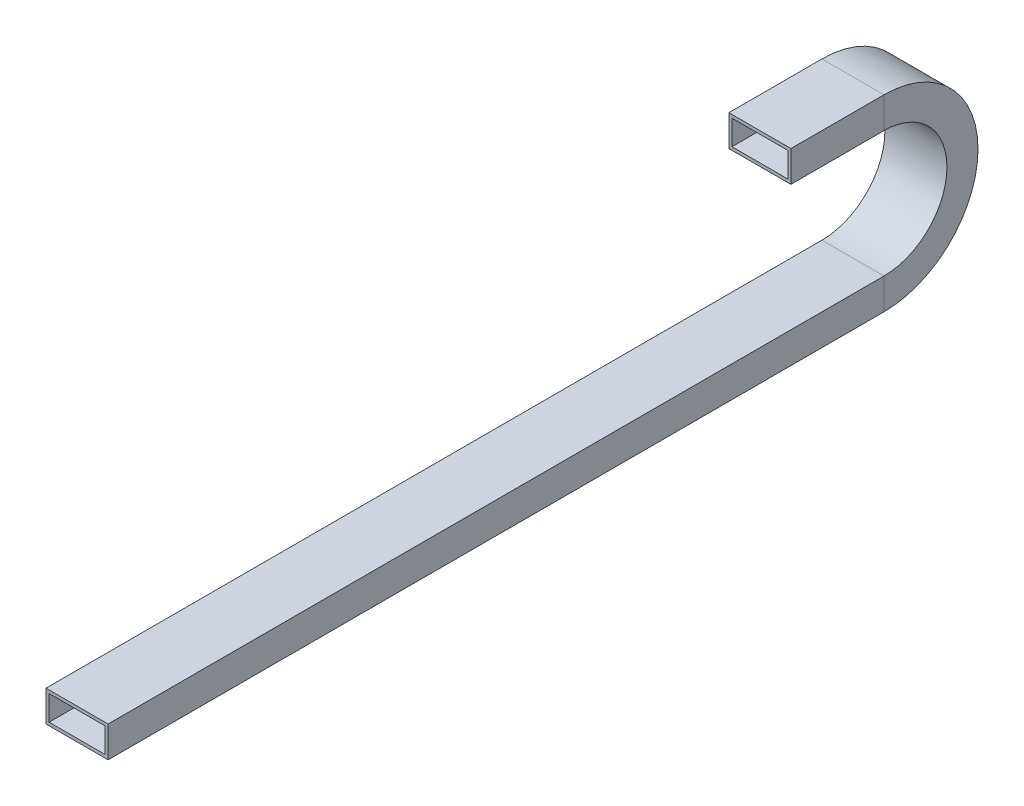
ISO-10303-21;
HEADER;
FILE_DESCRIPTION(('STEP AP214'),'2;1');
FILE_NAME('part.step','',(''),(''),'','','');
FILE_SCHEMA(('AUTOMOTIVE_DESIGN { 1 0 10303 214 1 1 1 1 }'));
ENDSEC;
DATA;
#1=APPLICATION_CONTEXT('core data for automotive mechanical design processes');
#2=APPLICATION_PROTOCOL_DEFINITION('international standard','automotive_design',2000,#1);
#3=PRODUCT_CONTEXT('',#1,'mechanical');
#4=PRODUCT('Part','Part','',(#3));
#5=PRODUCT_RELATED_PRODUCT_CATEGORY('part','',(#4));
#6=PRODUCT_DEFINITION_FORMATION('','',#4);
#7=PRODUCT_DEFINITION_CONTEXT('part definition',#1,'design');
#8=PRODUCT_DEFINITION('design','',#6,#7);
#9=PRODUCT_DEFINITION_SHAPE('','',#8);
#10=(LENGTH_UNIT() NAMED_UNIT(*) SI_UNIT(.MILLI.,.METRE.));
#11=(NAMED_UNIT(*) PLANE_ANGLE_UNIT() SI_UNIT($,.RADIAN.));
#12=(NAMED_UNIT(*) SI_UNIT($,.STERADIAN.) SOLID_ANGLE_UNIT());
#13=UNCERTAINTY_MEASURE_WITH_UNIT(LENGTH_MEASURE(1.E-05),#10,'distance_accuracy_value','');
#14=(GEOMETRIC_REPRESENTATION_CONTEXT(3) GLOBAL_UNCERTAINTY_ASSIGNED_CONTEXT((#13)) GLOBAL_UNIT_ASSIGNED_CONTEXT((#10,
#11,#12)) REPRESENTATION_CONTEXT('',''));
#15=CARTESIAN_POINT('',(0.,0.,0.));
#16=DIRECTION('',(0.,0.,1.));
#17=DIRECTION('',(1.,0.,0.));
#18=AXIS2_PLACEMENT_3D('',#15,#16,#17);
#19=CARTESIAN_POINT('',(20.,0.,0.));
#20=DIRECTION('',(-1.,0.,0.));
#21=DIRECTION('',(0.,0.,1.));
#22=AXIS2_PLACEMENT_3D('',#19,#20,#21);
#23=PLANE('',#22);
#24=DIRECTION('',(0.,0.,-1.));
#25=VECTOR('',#24,1.);
#26=CARTESIAN_POINT('',(20.,10.,0.));
#27=LINE('',#26,#25);
#28=CARTESIAN_POINT('',(20.,10.,0.));
#29=VERTEX_POINT('',#28);
#30=CARTESIAN_POINT('',(20.,10.,-250.));
#31=VERTEX_POINT('',#30);
#32=EDGE_CURVE('E176',#29,#31,#27,.T.);
#33=ORIENTED_EDGE('',*,*,#32,.F.);
#34=DIRECTION('',(0.,1.,0.));
#35=VECTOR('',#34,1.);
#36=CARTESIAN_POINT('',(20.,0.,0.));
#37=LINE('',#36,#35);
#38=CARTESIAN_POINT('',(20.,0.,0.));
#39=VERTEX_POINT('',#38);
#40=EDGE_CURVE('E205',#39,#29,#37,.T.);
#41=ORIENTED_EDGE('',*,*,#40,.F.);
#42=DIRECTION('',(0.,0.,-1.));
#43=VECTOR('',#42,1.);
#44=CARTESIAN_POINT('',(20.,0.,0.));
#45=LINE('',#44,#43);
#46=CARTESIAN_POINT('',(20.,0.,-250.));
#47=VERTEX_POINT('',#46);
#48=EDGE_CURVE('E202',#39,#47,#45,.T.);
#49=ORIENTED_EDGE('',*,*,#48,.T.);
#50=DIRECTION('',(0.,1.,0.));
#51=VECTOR('',#50,1.);
#52=CARTESIAN_POINT('',(20.,0.,-250.));
#53=LINE('',#52,#51);
#54=EDGE_CURVE('E198',#47,#31,#53,.T.);
#55=ORIENTED_EDGE('',*,*,#54,.T.);
#56=EDGE_LOOP('',(#33,#41,#49,#55));
#57=FACE_BOUND('',#56,.T.);
#58=ADVANCED_FACE('F33',(#57),#23,.F.);
#59=CARTESIAN_POINT('',(0.,10.,0.));
#60=DIRECTION('',(0.,-1.,0.));
#61=DIRECTION('',(0.,0.,-1.));
#62=AXIS2_PLACEMENT_3D('',#59,#60,#61);
#63=PLANE('',#62);
#64=DIRECTION('',(0.,0.,-1.));
#65=VECTOR('',#64,1.);
#66=CARTESIAN_POINT('',(0.,10.,0.));
#67=LINE('',#66,#65);
#68=CARTESIAN_POINT('',(0.,10.,0.));
#69=VERTEX_POINT('',#68);
#70=CARTESIAN_POINT('',(0.,10.,-250.));
#71=VERTEX_POINT('',#70);
#72=EDGE_CURVE('E140',#69,#71,#67,.T.);
#73=ORIENTED_EDGE('',*,*,#72,.F.);
#74=DIRECTION('',(-1.,0.,0.));
#75=VECTOR('',#74,1.);
#76=CARTESIAN_POINT('',(0.,10.,0.));
#77=LINE('',#76,#75);
#78=EDGE_CURVE('E159',#29,#69,#77,.T.);
#79=ORIENTED_EDGE('',*,*,#78,.F.);
#80=ORIENTED_EDGE('',*,*,#32,.T.);
#81=DIRECTION('',(-1.,0.,0.));
#82=VECTOR('',#81,1.);
#83=CARTESIAN_POINT('',(0.,10.,-250.));
#84=LINE('',#83,#82);
#85=EDGE_CURVE('E143',#31,#71,#84,.T.);
#86=ORIENTED_EDGE('',*,*,#85,.T.);
#87=EDGE_LOOP('',(#73,#79,#80,#86));
#88=FACE_BOUND('',#87,.T.);
#89=ADVANCED_FACE('F383',(#88),#63,.F.);
#90=CARTESIAN_POINT('',(0.,0.,0.));
#91=DIRECTION('',(1.,0.,0.));
#92=DIRECTION('',(0.,0.,-1.));
#93=AXIS2_PLACEMENT_3D('',#90,#91,#92);
#94=PLANE('',#93);
#95=DIRECTION('',(0.,0.,-1.));
#96=VECTOR('',#95,1.);
#97=CARTESIAN_POINT('',(0.,0.,0.));
#98=LINE('',#97,#96);
#99=CARTESIAN_POINT('',(0.,0.,0.));
#100=VERTEX_POINT('',#99);
#101=CARTESIAN_POINT('',(0.,0.,-250.));
#102=VERTEX_POINT('',#101);
#103=EDGE_CURVE('E130',#100,#102,#98,.T.);
#104=ORIENTED_EDGE('',*,*,#103,.F.);
#105=DIRECTION('',(0.,-1.,0.));
#106=VECTOR('',#105,1.);
#107=CARTESIAN_POINT('',(0.,0.,0.));
#108=LINE('',#107,#106);
#109=EDGE_CURVE('E153',#69,#100,#108,.T.);
#110=ORIENTED_EDGE('',*,*,#109,.F.);
#111=ORIENTED_EDGE('',*,*,#72,.T.);
#112=DIRECTION('',(0.,-1.,0.));
#113=VECTOR('',#112,1.);
#114=CARTESIAN_POINT('',(0.,0.,-250.));
#115=LINE('',#114,#113);
#116=EDGE_CURVE('E114',#71,#102,#115,.T.);
#117=ORIENTED_EDGE('',*,*,#116,.T.);
#118=EDGE_LOOP('',(#104,#110,#111,#117));
#119=FACE_BOUND('',#118,.T.);
#120=ADVANCED_FACE('F138',(#119),#94,.F.);
#121=CARTESIAN_POINT('',(0.,0.,0.));
#122=DIRECTION('',(0.,1.,0.));
#123=DIRECTION('',(0.,0.,1.));
#124=AXIS2_PLACEMENT_3D('',#121,#122,#123);
#125=PLANE('',#124);
#126=DIRECTION('',(1.,0.,0.));
#127=VECTOR('',#126,1.);
#128=CARTESIAN_POINT('',(0.,0.,-250.));
#129=LINE('',#128,#127);
#130=EDGE_CURVE('E122',#102,#47,#129,.T.);
#131=ORIENTED_EDGE('',*,*,#130,.T.);
#132=ORIENTED_EDGE('',*,*,#48,.F.);
#133=DIRECTION('',(1.,0.,0.));
#134=VECTOR('',#133,1.);
#135=CARTESIAN_POINT('',(0.,0.,0.));
#136=LINE('',#135,#134);
#137=EDGE_CURVE('E134',#100,#39,#136,.T.);
#138=ORIENTED_EDGE('',*,*,#137,.F.);
#139=ORIENTED_EDGE('',*,*,#103,.T.);
#140=EDGE_LOOP('',(#131,#132,#138,#139));
#141=FACE_BOUND('',#140,.T.);
#142=ADVANCED_FACE('F133',(#141),#125,.F.);
#143=CARTESIAN_POINT('',(20.,0.,-250.));
#144=DIRECTION('',(-1.,0.,0.));
#145=DIRECTION('',(0.,0.,1.));
#146=AXIS2_PLACEMENT_3D('',#143,#144,#145);
#147=PLANE('',#146);
#148=CARTESIAN_POINT('',(20.,30.2845692442659,-250.));
#149=DIRECTION('',(1.,0.,0.));
#150=DIRECTION('',(0.,-1.,0.));
#151=AXIS2_PLACEMENT_3D('',#148,#149,#150);
#152=CIRCLE('',#151,20.2845692442659);
#153=CARTESIAN_POINT('',(20.,50.5691384885319,-250.));
#154=VERTEX_POINT('',#153);
#155=EDGE_CURVE('E180',#31,#154,#152,.T.);
#156=ORIENTED_EDGE('',*,*,#155,.F.);
#157=ORIENTED_EDGE('',*,*,#54,.F.);
#158=CARTESIAN_POINT('',(20.,30.2845692442659,-250.));
#159=DIRECTION('',(1.,0.,0.));
#160=DIRECTION('',(0.,-1.,0.));
#161=AXIS2_PLACEMENT_3D('',#158,#159,#160);
#162=CIRCLE('',#161,30.2845692442659);
#163=CARTESIAN_POINT('',(20.,60.5691384885319,-250.));
#164=VERTEX_POINT('',#163);
#165=EDGE_CURVE('E126',#47,#164,#162,.T.);
#166=ORIENTED_EDGE('',*,*,#165,.T.);
#167=DIRECTION('',(0.,-1.,0.));
#168=VECTOR('',#167,1.);
#169=CARTESIAN_POINT('',(20.,60.5691384885319,-250.));
#170=LINE('',#169,#168);
#171=EDGE_CURVE('E192',#164,#154,#170,.T.);
#172=ORIENTED_EDGE('',*,*,#171,.T.);
#173=EDGE_LOOP('',(#156,#157,#166,#172));
#174=FACE_BOUND('',#173,.T.);
#175=ADVANCED_FACE('F196',(#174),#147,.F.);
#176=CARTESIAN_POINT('',(0.,30.2845692442659,-250.));
#177=DIRECTION('',(1.,0.,0.));
#178=DIRECTION('',(0.,0.,-1.));
#179=AXIS2_PLACEMENT_3D('',#176,#177,#178);
#180=CYLINDRICAL_SURFACE('',#179,20.2845692442659);
#181=CARTESIAN_POINT('',(0.,30.2845692442659,-250.));
#182=DIRECTION('',(1.,0.,0.));
#183=DIRECTION('',(0.,-1.,0.));
#184=AXIS2_PLACEMENT_3D('',#181,#182,#183);
#185=CIRCLE('',#184,20.2845692442659);
#186=CARTESIAN_POINT('',(0.,50.5691384885319,-250.));
#187=VERTEX_POINT('',#186);
#188=EDGE_CURVE('E149',#71,#187,#185,.T.);
#189=ORIENTED_EDGE('',*,*,#188,.F.);
#190=ORIENTED_EDGE('',*,*,#85,.F.);
#191=ORIENTED_EDGE('',*,*,#155,.T.);
#192=DIRECTION('',(-1.,0.,0.));
#193=VECTOR('',#192,1.);
#194=CARTESIAN_POINT('',(0.,50.5691384885319,-250.));
#195=LINE('',#194,#193);
#196=EDGE_CURVE('E178',#154,#187,#195,.T.);
#197=ORIENTED_EDGE('',*,*,#196,.T.);
#198=EDGE_LOOP('',(#189,#190,#191,#197));
#199=FACE_BOUND('',#198,.T.);
#200=ADVANCED_FACE('F184',(#199),#180,.F.);
#201=CARTESIAN_POINT('',(0.,0.,-250.));
#202=DIRECTION('',(1.,0.,0.));
#203=DIRECTION('',(0.,0.,-1.));
#204=AXIS2_PLACEMENT_3D('',#201,#202,#203);
#205=PLANE('',#204);
#206=CARTESIAN_POINT('',(0.,30.2845692442659,-250.));
#207=DIRECTION('',(1.,0.,0.));
#208=DIRECTION('',(0.,-1.,0.));
#209=AXIS2_PLACEMENT_3D('',#206,#207,#208);
#210=CIRCLE('',#209,30.2845692442659);
#211=CARTESIAN_POINT('',(0.,60.5691384885319,-250.));
#212=VERTEX_POINT('',#211);
#213=EDGE_CURVE('E109',#102,#212,#210,.T.);
#214=ORIENTED_EDGE('',*,*,#213,.F.);
#215=ORIENTED_EDGE('',*,*,#116,.F.);
#216=ORIENTED_EDGE('',*,*,#188,.T.);
#217=DIRECTION('',(0.,1.,0.));
#218=VECTOR('',#217,1.);
#219=CARTESIAN_POINT('',(0.,60.5691384885319,-250.));
#220=LINE('',#219,#218);
#221=EDGE_CURVE('E117',#187,#212,#220,.T.);
#222=ORIENTED_EDGE('',*,*,#221,.T.);
#223=EDGE_LOOP('',(#214,#215,#216,#222));
#224=FACE_BOUND('',#223,.T.);
#225=ADVANCED_FACE('F111',(#224),#205,.F.);
#226=CARTESIAN_POINT('',(0.,30.2845692442659,-250.));
#227=DIRECTION('',(1.,0.,0.));
#228=DIRECTION('',(0.,0.,-1.));
#229=AXIS2_PLACEMENT_3D('',#226,#227,#228);
#230=CYLINDRICAL_SURFACE('',#229,30.2845692442659);
#231=DIRECTION('',(1.,0.,0.));
#232=VECTOR('',#231,1.);
#233=CARTESIAN_POINT('',(0.,60.5691384885319,-250.));
#234=LINE('',#233,#232);
#235=EDGE_CURVE('E37',#212,#164,#234,.T.);
#236=ORIENTED_EDGE('',*,*,#235,.T.);
#237=ORIENTED_EDGE('',*,*,#165,.F.);
#238=ORIENTED_EDGE('',*,*,#130,.F.);
#239=ORIENTED_EDGE('',*,*,#213,.T.);
#240=EDGE_LOOP('',(#236,#237,#238,#239));
#241=FACE_BOUND('',#240,.T.);
#242=ADVANCED_FACE('F124',(#241),#230,.T.);
#243=CARTESIAN_POINT('',(20.,60.5691384885319,-250.));
#244=DIRECTION('',(-1.,0.,0.));
#245=DIRECTION('',(0.,0.,1.));
#246=AXIS2_PLACEMENT_3D('',#243,#244,#245);
#247=PLANE('',#246);
#248=DIRECTION('',(0.,0.,1.));
#249=VECTOR('',#248,1.);
#250=CARTESIAN_POINT('',(20.,50.5691384885319,-250.));
#251=LINE('',#250,#249);
#252=CARTESIAN_POINT('',(20.,50.5691384885319,-220.));
#253=VERTEX_POINT('',#252);
#254=EDGE_CURVE('E162',#154,#253,#251,.T.);
#255=ORIENTED_EDGE('',*,*,#254,.F.);
#256=ORIENTED_EDGE('',*,*,#171,.F.);
#257=DIRECTION('',(0.,0.,1.));
#258=VECTOR('',#257,1.);
#259=CARTESIAN_POINT('',(20.,60.5691384885319,-250.));
#260=LINE('',#259,#258);
#261=CARTESIAN_POINT('',(20.,60.5691384885319,-220.));
#262=VERTEX_POINT('',#261);
#263=EDGE_CURVE('E166',#164,#262,#260,.T.);
#264=ORIENTED_EDGE('',*,*,#263,.T.);
#265=DIRECTION('',(0.,-1.,0.));
#266=VECTOR('',#265,1.);
#267=CARTESIAN_POINT('',(20.,60.5691384885319,-220.));
#268=LINE('',#267,#266);
#269=EDGE_CURVE('E215',#262,#253,#268,.T.);
#270=ORIENTED_EDGE('',*,*,#269,.T.);
#271=EDGE_LOOP('',(#255,#256,#264,#270));
#272=FACE_BOUND('',#271,.T.);
#273=ADVANCED_FACE('F193',(#272),#247,.F.);
#274=CARTESIAN_POINT('',(0.,50.5691384885319,-250.));
#275=DIRECTION('',(0.,1.,0.));
#276=DIRECTION('',(0.,0.,1.));
#277=AXIS2_PLACEMENT_3D('',#274,#275,#276);
#278=PLANE('',#277);
#279=DIRECTION('',(0.,0.,1.));
#280=VECTOR('',#279,1.);
#281=CARTESIAN_POINT('',(0.,50.5691384885319,-250.));
#282=LINE('',#281,#280);
#283=CARTESIAN_POINT('',(0.,50.5691384885319,-220.));
#284=VERTEX_POINT('',#283);
#285=EDGE_CURVE('E146',#187,#284,#282,.T.);
#286=ORIENTED_EDGE('',*,*,#285,.F.);
#287=ORIENTED_EDGE('',*,*,#196,.F.);
#288=ORIENTED_EDGE('',*,*,#254,.T.);
#289=DIRECTION('',(-1.,0.,0.));
#290=VECTOR('',#289,1.);
#291=CARTESIAN_POINT('',(0.,50.5691384885319,-220.));
#292=LINE('',#291,#290);
#293=EDGE_CURVE('E187',#253,#284,#292,.T.);
#294=ORIENTED_EDGE('',*,*,#293,.T.);
#295=EDGE_LOOP('',(#286,#287,#288,#294));
#296=FACE_BOUND('',#295,.T.);
#297=ADVANCED_FACE('F186',(#296),#278,.F.);
#298=CARTESIAN_POINT('',(0.,60.5691384885319,-250.));
#299=DIRECTION('',(1.,0.,0.));
#300=DIRECTION('',(0.,0.,-1.));
#301=AXIS2_PLACEMENT_3D('',#298,#299,#300);
#302=PLANE('',#301);
#303=DIRECTION('',(0.,0.,1.));
#304=VECTOR('',#303,1.);
#305=CARTESIAN_POINT('',(0.,60.5691384885319,-250.));
#306=LINE('',#305,#304);
#307=CARTESIAN_POINT('',(0.,60.5691384885319,-220.));
#308=VERTEX_POINT('',#307);
#309=EDGE_CURVE('E151',#212,#308,#306,.T.);
#310=ORIENTED_EDGE('',*,*,#309,.F.);
#311=ORIENTED_EDGE('',*,*,#221,.F.);
#312=ORIENTED_EDGE('',*,*,#285,.T.);
#313=DIRECTION('',(0.,1.,0.));
#314=VECTOR('',#313,1.);
#315=CARTESIAN_POINT('',(0.,60.5691384885319,-220.));
#316=LINE('',#315,#314);
#317=EDGE_CURVE('E189',#284,#308,#316,.T.);
#318=ORIENTED_EDGE('',*,*,#317,.T.);
#319=EDGE_LOOP('',(#310,#311,#312,#318));
#320=FACE_BOUND('',#319,.T.);
#321=ADVANCED_FACE('F188',(#320),#302,.F.);
#322=CARTESIAN_POINT('',(0.,60.5691384885319,-250.));
#323=DIRECTION('',(0.,-1.,0.));
#324=DIRECTION('',(0.,0.,-1.));
#325=AXIS2_PLACEMENT_3D('',#322,#323,#324);
#326=PLANE('',#325);
#327=DIRECTION('',(1.,0.,0.));
#328=VECTOR('',#327,1.);
#329=CARTESIAN_POINT('',(0.,60.5691384885319,-220.));
#330=LINE('',#329,#328);
#331=EDGE_CURVE('E217',#308,#262,#330,.T.);
#332=ORIENTED_EDGE('',*,*,#331,.T.);
#333=ORIENTED_EDGE('',*,*,#263,.F.);
#334=ORIENTED_EDGE('',*,*,#235,.F.);
#335=ORIENTED_EDGE('',*,*,#309,.T.);
#336=EDGE_LOOP('',(#332,#333,#334,#335));
#337=FACE_BOUND('',#336,.T.);
#338=ADVANCED_FACE('F35',(#337),#326,.F.);
#339=CARTESIAN_POINT('',(0.,0.,0.));
#340=DIRECTION('',(0.,0.,-1.));
#341=DIRECTION('',(-1.,0.,0.));
#342=AXIS2_PLACEMENT_3D('',#339,#340,#341);
#343=PLANE('',#342);
#344=ORIENTED_EDGE('',*,*,#109,.T.);
#345=ORIENTED_EDGE('',*,*,#137,.T.);
#346=ORIENTED_EDGE('',*,*,#40,.T.);
#347=ORIENTED_EDGE('',*,*,#78,.T.);
#348=EDGE_LOOP('',(#344,#345,#346,#347));
#349=FACE_BOUND('',#348,.T.);
#350=DIRECTION('',(0.,-1.,0.));
#351=VECTOR('',#350,1.);
#352=CARTESIAN_POINT('',(1.,9.,0.));
#353=LINE('',#352,#351);
#354=CARTESIAN_POINT('',(1.,1.,0.));
#355=VERTEX_POINT('',#354);
#356=CARTESIAN_POINT('',(1.,9.,0.));
#357=VERTEX_POINT('',#356);
#358=EDGE_CURVE('E230',#355,#357,#353,.F.);
#359=ORIENTED_EDGE('',*,*,#358,.T.);
#360=DIRECTION('',(-1.,0.,0.));
#361=VECTOR('',#360,1.);
#362=CARTESIAN_POINT('',(1.,9.,0.));
#363=LINE('',#362,#361);
#364=CARTESIAN_POINT('',(19.,9.,0.));
#365=VERTEX_POINT('',#364);
#366=EDGE_CURVE('E218',#357,#365,#363,.F.);
#367=ORIENTED_EDGE('',*,*,#366,.T.);
#368=DIRECTION('',(0.,1.,0.));
#369=VECTOR('',#368,1.);
#370=CARTESIAN_POINT('',(19.,9.,0.));
#371=LINE('',#370,#369);
#372=CARTESIAN_POINT('',(19.,1.,0.));
#373=VERTEX_POINT('',#372);
#374=EDGE_CURVE('E253',#365,#373,#371,.F.);
#375=ORIENTED_EDGE('',*,*,#374,.T.);
#376=DIRECTION('',(1.,0.,0.));
#377=VECTOR('',#376,1.);
#378=CARTESIAN_POINT('',(1.,1.,0.));
#379=LINE('',#378,#377);
#380=EDGE_CURVE('E234',#373,#355,#379,.F.);
#381=ORIENTED_EDGE('',*,*,#380,.T.);
#382=EDGE_LOOP('',(#359,#367,#375,#381));
#383=FACE_BOUND('',#382,.T.);
#384=ADVANCED_FACE('F298',(#349,#383),#343,.F.);
#385=CARTESIAN_POINT('',(0.,60.5691384885319,-220.));
#386=DIRECTION('',(0.,0.,1.));
#387=DIRECTION('',(-1.,0.,0.));
#388=AXIS2_PLACEMENT_3D('',#385,#386,#387);
#389=PLANE('',#388);
#390=ORIENTED_EDGE('',*,*,#317,.F.);
#391=ORIENTED_EDGE('',*,*,#293,.F.);
#392=ORIENTED_EDGE('',*,*,#269,.F.);
#393=ORIENTED_EDGE('',*,*,#331,.F.);
#394=EDGE_LOOP('',(#390,#391,#392,#393));
#395=FACE_BOUND('',#394,.T.);
#396=DIRECTION('',(0.,1.,0.));
#397=VECTOR('',#396,1.);
#398=CARTESIAN_POINT('',(1.,51.5691384885319,-220.));
#399=LINE('',#398,#397);
#400=CARTESIAN_POINT('',(1.,59.5691384885319,-220.));
#401=VERTEX_POINT('',#400);
#402=CARTESIAN_POINT('',(1.,51.5691384885319,-220.));
#403=VERTEX_POINT('',#402);
#404=EDGE_CURVE('E11',#401,#403,#399,.F.);
#405=ORIENTED_EDGE('',*,*,#404,.F.);
#406=DIRECTION('',(1.,0.,0.));
#407=VECTOR('',#406,1.);
#408=CARTESIAN_POINT('',(1.,59.5691384885319,-220.));
#409=LINE('',#408,#407);
#410=CARTESIAN_POINT('',(19.,59.5691384885319,-220.));
#411=VERTEX_POINT('',#410);
#412=EDGE_CURVE('E52',#411,#401,#409,.F.);
#413=ORIENTED_EDGE('',*,*,#412,.F.);
#414=DIRECTION('',(0.,-1.,0.));
#415=VECTOR('',#414,1.);
#416=CARTESIAN_POINT('',(19.,51.5691384885319,-220.));
#417=LINE('',#416,#415);
#418=CARTESIAN_POINT('',(19.,51.5691384885319,-220.));
#419=VERTEX_POINT('',#418);
#420=EDGE_CURVE('E255',#419,#411,#417,.F.);
#421=ORIENTED_EDGE('',*,*,#420,.F.);
#422=DIRECTION('',(-1.,0.,0.));
#423=VECTOR('',#422,1.);
#424=CARTESIAN_POINT('',(1.,51.5691384885319,-220.));
#425=LINE('',#424,#423);
#426=EDGE_CURVE('E274',#403,#419,#425,.F.);
#427=ORIENTED_EDGE('',*,*,#426,.F.);
#428=EDGE_LOOP('',(#405,#413,#421,#427));
#429=FACE_BOUND('',#428,.T.);
#430=ADVANCED_FACE('F374',(#395,#429),#389,.T.);
#431=CARTESIAN_POINT('',(1.,9.,0.));
#432=DIRECTION('',(0.,1.,0.));
#433=DIRECTION('',(-1.,0.,0.));
#434=AXIS2_PLACEMENT_3D('',#431,#432,#433);
#435=PLANE('',#434);
#436=DIRECTION('',(0.,0.,-1.));
#437=VECTOR('',#436,1.);
#438=CARTESIAN_POINT('',(19.,9.,0.));
#439=LINE('',#438,#437);
#440=CARTESIAN_POINT('',(19.,9.,-250.));
#441=VERTEX_POINT('',#440);
#442=EDGE_CURVE('E269',#365,#441,#439,.T.);
#443=ORIENTED_EDGE('',*,*,#442,.F.);
#444=ORIENTED_EDGE('',*,*,#366,.F.);
#445=DIRECTION('',(0.,0.,-1.));
#446=VECTOR('',#445,1.);
#447=CARTESIAN_POINT('',(1.,9.,0.));
#448=LINE('',#447,#446);
#449=CARTESIAN_POINT('',(1.,9.,-250.));
#450=VERTEX_POINT('',#449);
#451=EDGE_CURVE('E233',#357,#450,#448,.T.);
#452=ORIENTED_EDGE('',*,*,#451,.T.);
#453=DIRECTION('',(-1.,0.,0.));
#454=VECTOR('',#453,1.);
#455=CARTESIAN_POINT('',(1.,9.,-250.));
#456=LINE('',#455,#454);
#457=EDGE_CURVE('E288',#450,#441,#456,.F.);
#458=ORIENTED_EDGE('',*,*,#457,.T.);
#459=EDGE_LOOP('',(#443,#444,#452,#458));
#460=FACE_BOUND('',#459,.T.);
#461=ADVANCED_FACE('F306',(#460),#435,.F.);
#462=CARTESIAN_POINT('',(19.,9.,0.));
#463=DIRECTION('',(1.,0.,0.));
#464=DIRECTION('',(0.,1.,0.));
#465=AXIS2_PLACEMENT_3D('',#462,#463,#464);
#466=PLANE('',#465);
#467=DIRECTION('',(0.,0.,-1.));
#468=VECTOR('',#467,1.);
#469=CARTESIAN_POINT('',(19.,1.,0.));
#470=LINE('',#469,#468);
#471=CARTESIAN_POINT('',(19.,1.,-250.));
#472=VERTEX_POINT('',#471);
#473=EDGE_CURVE('E250',#373,#472,#470,.T.);
#474=ORIENTED_EDGE('',*,*,#473,.F.);
#475=ORIENTED_EDGE('',*,*,#374,.F.);
#476=ORIENTED_EDGE('',*,*,#442,.T.);
#477=DIRECTION('',(0.,1.,0.));
#478=VECTOR('',#477,1.);
#479=CARTESIAN_POINT('',(19.,9.,-250.));
#480=LINE('',#479,#478);
#481=EDGE_CURVE('E266',#441,#472,#480,.F.);
#482=ORIENTED_EDGE('',*,*,#481,.T.);
#483=EDGE_LOOP('',(#474,#475,#476,#482));
#484=FACE_BOUND('',#483,.T.);
#485=ADVANCED_FACE('F310',(#484),#466,.F.);
#486=CARTESIAN_POINT('',(1.,1.,0.));
#487=DIRECTION('',(0.,-1.,0.));
#488=DIRECTION('',(1.,0.,0.));
#489=AXIS2_PLACEMENT_3D('',#486,#487,#488);
#490=PLANE('',#489);
#491=DIRECTION('',(0.,0.,-1.));
#492=VECTOR('',#491,1.);
#493=CARTESIAN_POINT('',(1.,1.,0.));
#494=LINE('',#493,#492);
#495=CARTESIAN_POINT('',(1.,1.,-250.));
#496=VERTEX_POINT('',#495);
#497=EDGE_CURVE('E229',#355,#496,#494,.T.);
#498=ORIENTED_EDGE('',*,*,#497,.F.);
#499=ORIENTED_EDGE('',*,*,#380,.F.);
#500=ORIENTED_EDGE('',*,*,#473,.T.);
#501=DIRECTION('',(1.,0.,0.));
#502=VECTOR('',#501,1.);
#503=CARTESIAN_POINT('',(1.,1.,-250.));
#504=LINE('',#503,#502);
#505=EDGE_CURVE('E247',#472,#496,#504,.F.);
#506=ORIENTED_EDGE('',*,*,#505,.T.);
#507=EDGE_LOOP('',(#498,#499,#500,#506));
#508=FACE_BOUND('',#507,.T.);
#509=ADVANCED_FACE('F350',(#508),#490,.F.);
#510=CARTESIAN_POINT('',(1.,9.,0.));
#511=DIRECTION('',(-1.,0.,0.));
#512=DIRECTION('',(0.,0.,1.));
#513=AXIS2_PLACEMENT_3D('',#510,#511,#512);
#514=PLANE('',#513);
#515=DIRECTION('',(0.,-1.,0.));
#516=VECTOR('',#515,1.);
#517=CARTESIAN_POINT('',(1.,9.,-250.));
#518=LINE('',#517,#516);
#519=EDGE_CURVE('E225',#496,#450,#518,.F.);
#520=ORIENTED_EDGE('',*,*,#519,.T.);
#521=ORIENTED_EDGE('',*,*,#451,.F.);
#522=ORIENTED_EDGE('',*,*,#358,.F.);
#523=ORIENTED_EDGE('',*,*,#497,.T.);
#524=EDGE_LOOP('',(#520,#521,#522,#523));
#525=FACE_BOUND('',#524,.T.);
#526=ADVANCED_FACE('F348',(#525),#514,.F.);
#527=CARTESIAN_POINT('',(0.,30.2845692442659,-250.));
#528=DIRECTION('',(1.,0.,0.));
#529=DIRECTION('',(0.,0.,-1.));
#530=AXIS2_PLACEMENT_3D('',#527,#528,#529);
#531=CYLINDRICAL_SURFACE('',#530,21.2845692442659);
#532=CARTESIAN_POINT('',(19.,30.2845692442659,-250.));
#533=DIRECTION('',(1.,0.,0.));
#534=DIRECTION('',(0.,-1.,0.));
#535=AXIS2_PLACEMENT_3D('',#532,#533,#534);
#536=CIRCLE('',#535,21.2845692442659);
#537=CARTESIAN_POINT('',(19.,51.5691384885319,-250.));
#538=VERTEX_POINT('',#537);
#539=EDGE_CURVE('E263',#441,#538,#536,.T.);
#540=ORIENTED_EDGE('',*,*,#539,.F.);
#541=ORIENTED_EDGE('',*,*,#457,.F.);
#542=CARTESIAN_POINT('',(1.,30.2845692442659,-250.));
#543=DIRECTION('',(1.,0.,0.));
#544=DIRECTION('',(0.,-1.,0.));
#545=AXIS2_PLACEMENT_3D('',#542,#543,#544);
#546=CIRCLE('',#545,21.2845692442659);
#547=CARTESIAN_POINT('',(1.,51.5691384885319,-250.));
#548=VERTEX_POINT('',#547);
#549=EDGE_CURVE('E228',#450,#548,#546,.T.);
#550=ORIENTED_EDGE('',*,*,#549,.T.);
#551=DIRECTION('',(-1.,0.,0.));
#552=VECTOR('',#551,1.);
#553=CARTESIAN_POINT('',(1.,51.5691384885319,-250.));
#554=LINE('',#553,#552);
#555=EDGE_CURVE('E281',#548,#538,#554,.F.);
#556=ORIENTED_EDGE('',*,*,#555,.T.);
#557=EDGE_LOOP('',(#540,#541,#550,#556));
#558=FACE_BOUND('',#557,.T.);
#559=ADVANCED_FACE('F357',(#558),#531,.T.);
#560=CARTESIAN_POINT('',(19.,9.00000000000001,-250.));
#561=DIRECTION('',(1.,0.,0.));
#562=DIRECTION('',(0.,0.,-1.));
#563=AXIS2_PLACEMENT_3D('',#560,#561,#562);
#564=PLANE('',#563);
#565=CARTESIAN_POINT('',(19.,30.2845692442659,-250.));
#566=DIRECTION('',(1.,0.,0.));
#567=DIRECTION('',(0.,-1.,0.));
#568=AXIS2_PLACEMENT_3D('',#565,#566,#567);
#569=CIRCLE('',#568,29.2845692442659);
#570=CARTESIAN_POINT('',(19.,59.5691384885319,-250.));
#571=VERTEX_POINT('',#570);
#572=EDGE_CURVE('E244',#472,#571,#569,.T.);
#573=ORIENTED_EDGE('',*,*,#572,.F.);
#574=ORIENTED_EDGE('',*,*,#481,.F.);
#575=ORIENTED_EDGE('',*,*,#539,.T.);
#576=DIRECTION('',(0.,-1.,0.));
#577=VECTOR('',#576,1.);
#578=CARTESIAN_POINT('',(19.,51.5691384885319,-250.));
#579=LINE('',#578,#577);
#580=EDGE_CURVE('E260',#538,#571,#579,.F.);
#581=ORIENTED_EDGE('',*,*,#580,.T.);
#582=EDGE_LOOP('',(#573,#574,#575,#581));
#583=FACE_BOUND('',#582,.T.);
#584=ADVANCED_FACE('F461',(#583),#564,.F.);
#585=CARTESIAN_POINT('',(0.,30.2845692442659,-250.));
#586=DIRECTION('',(1.,0.,0.));
#587=DIRECTION('',(0.,0.,-1.));
#588=AXIS2_PLACEMENT_3D('',#585,#586,#587);
#589=CYLINDRICAL_SURFACE('',#588,29.2845692442659);
#590=CARTESIAN_POINT('',(1.,30.2845692442659,-250.));
#591=DIRECTION('',(1.,0.,0.));
#592=DIRECTION('',(0.,-1.,0.));
#593=AXIS2_PLACEMENT_3D('',#590,#591,#592);
#594=CIRCLE('',#593,29.2845692442659);
#595=CARTESIAN_POINT('',(1.,59.5691384885319,-250.));
#596=VERTEX_POINT('',#595);
#597=EDGE_CURVE('E224',#496,#596,#594,.T.);
#598=ORIENTED_EDGE('',*,*,#597,.F.);
#599=ORIENTED_EDGE('',*,*,#505,.F.);
#600=ORIENTED_EDGE('',*,*,#572,.T.);
#601=DIRECTION('',(1.,0.,0.));
#602=VECTOR('',#601,1.);
#603=CARTESIAN_POINT('',(1.,59.5691384885319,-250.));
#604=LINE('',#603,#602);
#605=EDGE_CURVE('E241',#571,#596,#604,.F.);
#606=ORIENTED_EDGE('',*,*,#605,.T.);
#607=EDGE_LOOP('',(#598,#599,#600,#606));
#608=FACE_BOUND('',#607,.T.);
#609=ADVANCED_FACE('F342',(#608),#589,.F.);
#610=CARTESIAN_POINT('',(1.,9.00000000000001,-250.));
#611=DIRECTION('',(-1.,0.,0.));
#612=DIRECTION('',(0.,0.,1.));
#613=AXIS2_PLACEMENT_3D('',#610,#611,#612);
#614=PLANE('',#613);
#615=DIRECTION('',(0.,1.,0.));
#616=VECTOR('',#615,1.);
#617=CARTESIAN_POINT('',(1.,51.5691384885319,-250.));
#618=LINE('',#617,#616);
#619=EDGE_CURVE('E220',#596,#548,#618,.F.);
#620=ORIENTED_EDGE('',*,*,#619,.T.);
#621=ORIENTED_EDGE('',*,*,#549,.F.);
#622=ORIENTED_EDGE('',*,*,#519,.F.);
#623=ORIENTED_EDGE('',*,*,#597,.T.);
#624=EDGE_LOOP('',(#620,#621,#622,#623));
#625=FACE_BOUND('',#624,.T.);
#626=ADVANCED_FACE('F345',(#625),#614,.F.);
#627=CARTESIAN_POINT('',(1.,51.5691384885319,-250.));
#628=DIRECTION('',(0.,-1.,0.));
#629=DIRECTION('',(0.,0.,-1.));
#630=AXIS2_PLACEMENT_3D('',#627,#628,#629);
#631=PLANE('',#630);
#632=DIRECTION('',(0.,0.,1.));
#633=VECTOR('',#632,1.);
#634=CARTESIAN_POINT('',(19.,51.5691384885319,-250.));
#635=LINE('',#634,#633);
#636=EDGE_CURVE('E257',#538,#419,#635,.T.);
#637=ORIENTED_EDGE('',*,*,#636,.F.);
#638=ORIENTED_EDGE('',*,*,#555,.F.);
#639=DIRECTION('',(0.,0.,1.));
#640=VECTOR('',#639,1.);
#641=CARTESIAN_POINT('',(1.,51.5691384885319,-250.));
#642=LINE('',#641,#640);
#643=EDGE_CURVE('E223',#548,#403,#642,.T.);
#644=ORIENTED_EDGE('',*,*,#643,.T.);
#645=ORIENTED_EDGE('',*,*,#426,.T.);
#646=EDGE_LOOP('',(#637,#638,#644,#645));
#647=FACE_BOUND('',#646,.T.);
#648=ADVANCED_FACE('F486',(#647),#631,.F.);
#649=CARTESIAN_POINT('',(19.,51.5691384885319,-250.));
#650=DIRECTION('',(1.,0.,0.));
#651=DIRECTION('',(0.,1.,0.));
#652=AXIS2_PLACEMENT_3D('',#649,#650,#651);
#653=PLANE('',#652);
#654=DIRECTION('',(0.,0.,1.));
#655=VECTOR('',#654,1.);
#656=CARTESIAN_POINT('',(19.,59.5691384885319,-250.));
#657=LINE('',#656,#655);
#658=EDGE_CURVE('E238',#571,#411,#657,.T.);
#659=ORIENTED_EDGE('',*,*,#658,.F.);
#660=ORIENTED_EDGE('',*,*,#580,.F.);
#661=ORIENTED_EDGE('',*,*,#636,.T.);
#662=ORIENTED_EDGE('',*,*,#420,.T.);
#663=EDGE_LOOP('',(#659,#660,#661,#662));
#664=FACE_BOUND('',#663,.T.);
#665=ADVANCED_FACE('F370',(#664),#653,.F.);
#666=CARTESIAN_POINT('',(1.,59.5691384885319,-250.));
#667=DIRECTION('',(0.,1.,0.));
#668=DIRECTION('',(0.,0.,1.));
#669=AXIS2_PLACEMENT_3D('',#666,#667,#668);
#670=PLANE('',#669);
#671=DIRECTION('',(0.,0.,1.));
#672=VECTOR('',#671,1.);
#673=CARTESIAN_POINT('',(1.,59.5691384885319,-250.));
#674=LINE('',#673,#672);
#675=EDGE_CURVE('E43',#596,#401,#674,.T.);
#676=ORIENTED_EDGE('',*,*,#675,.F.);
#677=ORIENTED_EDGE('',*,*,#605,.F.);
#678=ORIENTED_EDGE('',*,*,#658,.T.);
#679=ORIENTED_EDGE('',*,*,#412,.T.);
#680=EDGE_LOOP('',(#676,#677,#678,#679));
#681=FACE_BOUND('',#680,.T.);
#682=ADVANCED_FACE('F364',(#681),#670,.F.);
#683=CARTESIAN_POINT('',(1.,51.5691384885319,-250.));
#684=DIRECTION('',(-1.,0.,0.));
#685=DIRECTION('',(0.,0.,1.));
#686=AXIS2_PLACEMENT_3D('',#683,#684,#685);
#687=PLANE('',#686);
#688=ORIENTED_EDGE('',*,*,#404,.T.);
#689=ORIENTED_EDGE('',*,*,#643,.F.);
#690=ORIENTED_EDGE('',*,*,#619,.F.);
#691=ORIENTED_EDGE('',*,*,#675,.T.);
#692=EDGE_LOOP('',(#688,#689,#690,#691));
#693=FACE_BOUND('',#692,.T.);
#694=ADVANCED_FACE('F362',(#693),#687,.F.);
#695=CLOSED_SHELL('',(#58,#89,#120,#142,#175,#200,#225,#242,#273,#297,#321,#338,#384,#430,#461,
#485,#509,#526,#559,#584,#609,#626,#648,#665,#682,#694));
#696=MANIFOLD_SOLID_BREP('B2',#695);
#697=ADVANCED_BREP_SHAPE_REPRESENTATION('',(#18,#696),#14);
#698=SHAPE_DEFINITION_REPRESENTATION(#9,#697);
ENDSEC;
END-ISO-10303-21;
